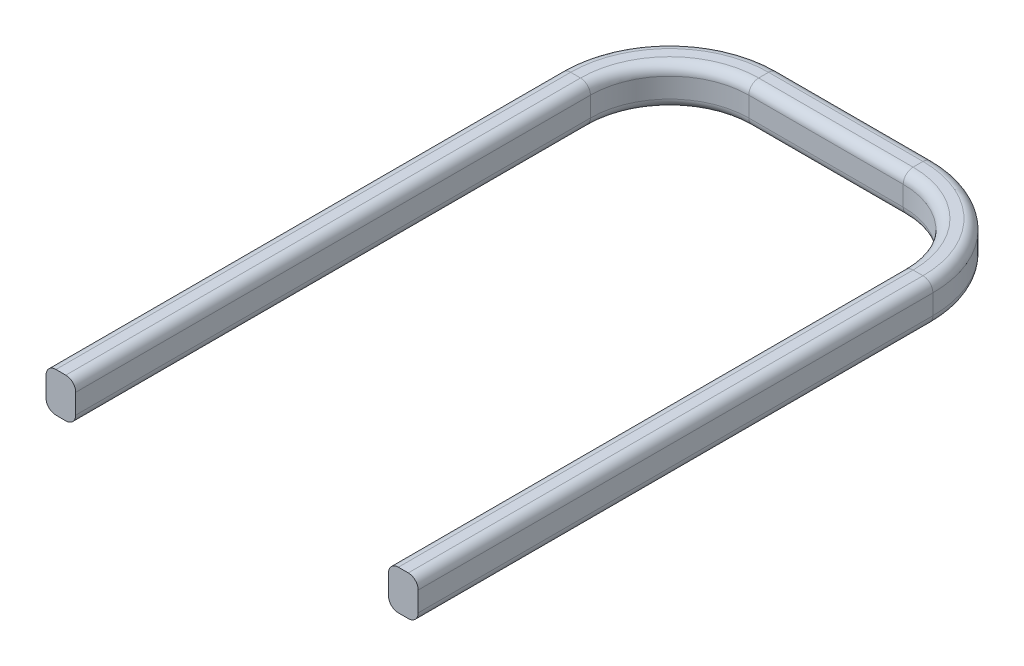
ISO-10303-21;
HEADER;
FILE_DESCRIPTION(('STEP AP214'),'2;1');
FILE_NAME('part.step','',(''),(''),'','','');
FILE_SCHEMA(('AUTOMOTIVE_DESIGN { 1 0 10303 214 1 1 1 1 }'));
ENDSEC;
DATA;
#1=APPLICATION_CONTEXT('core data for automotive mechanical design processes');
#2=APPLICATION_PROTOCOL_DEFINITION('international standard','automotive_design',2000,#1);
#3=PRODUCT_CONTEXT('',#1,'mechanical');
#4=PRODUCT('Part','Part','',(#3));
#5=PRODUCT_RELATED_PRODUCT_CATEGORY('part','',(#4));
#6=PRODUCT_DEFINITION_FORMATION('','',#4);
#7=PRODUCT_DEFINITION_CONTEXT('part definition',#1,'design');
#8=PRODUCT_DEFINITION('design','',#6,#7);
#9=PRODUCT_DEFINITION_SHAPE('','',#8);
#10=(LENGTH_UNIT() NAMED_UNIT(*) SI_UNIT(.MILLI.,.METRE.));
#11=(NAMED_UNIT(*) PLANE_ANGLE_UNIT() SI_UNIT($,.RADIAN.));
#12=(NAMED_UNIT(*) SI_UNIT($,.STERADIAN.) SOLID_ANGLE_UNIT());
#13=UNCERTAINTY_MEASURE_WITH_UNIT(LENGTH_MEASURE(1.E-05),#10,'distance_accuracy_value','');
#14=(GEOMETRIC_REPRESENTATION_CONTEXT(3) GLOBAL_UNCERTAINTY_ASSIGNED_CONTEXT((#13)) GLOBAL_UNIT_ASSIGNED_CONTEXT((#10,
#11,#12)) REPRESENTATION_CONTEXT('',''));
#15=CARTESIAN_POINT('',(0.,0.,0.));
#16=DIRECTION('',(0.,0.,1.));
#17=DIRECTION('',(1.,0.,0.));
#18=AXIS2_PLACEMENT_3D('',#15,#16,#17);
#19=CARTESIAN_POINT('',(0.,0.2775,-5.01095152284982));
#20=DIRECTION('',(0.,0.,1.));
#21=DIRECTION('',(1.,0.,0.));
#22=AXIS2_PLACEMENT_3D('',#19,#20,#21);
#23=PLANE('',#22);
#24=DIRECTION('',(0.,-1.,0.));
#25=VECTOR('',#24,1.);
#26=CARTESIAN_POINT('',(-2.0915,0.2775,-5.01095152284982));
#27=LINE('',#26,#25);
#28=CARTESIAN_POINT('',(-2.0915,0.61125,-5.01095152284982));
#29=VERTEX_POINT('',#28);
#30=CARTESIAN_POINT('',(-2.0915,0.38875,-5.01095152284982));
#31=VERTEX_POINT('',#30);
#32=EDGE_CURVE('E383',#29,#31,#27,.T.);
#33=ORIENTED_EDGE('',*,*,#32,.T.);
#34=CARTESIAN_POINT('',(-1.98025,0.38875,-5.01095152284982));
#35=DIRECTION('',(0.,0.,1.));
#36=DIRECTION('',(1.,0.,0.));
#37=AXIS2_PLACEMENT_3D('',#34,#35,#36);
#38=CIRCLE('',#37,0.11125);
#39=CARTESIAN_POINT('',(-1.98025,0.2775,-5.01095152284982));
#40=VERTEX_POINT('',#39);
#41=EDGE_CURVE('E317',#31,#40,#38,.T.);
#42=ORIENTED_EDGE('',*,*,#41,.T.);
#43=DIRECTION('',(1.,0.,0.));
#44=VECTOR('',#43,1.);
#45=CARTESIAN_POINT('',(-1.75775,0.2775,-5.01095152284982));
#46=LINE('',#45,#44);
#47=CARTESIAN_POINT('',(-1.869,0.2775,-5.01095152284982));
#48=VERTEX_POINT('',#47);
#49=EDGE_CURVE('E391',#40,#48,#46,.T.);
#50=ORIENTED_EDGE('',*,*,#49,.T.);
#51=CARTESIAN_POINT('',(-1.869,0.38875,-5.01095152284982));
#52=DIRECTION('',(0.,0.,1.));
#53=DIRECTION('',(1.,0.,0.));
#54=AXIS2_PLACEMENT_3D('',#51,#52,#53);
#55=CIRCLE('',#54,0.11125);
#56=CARTESIAN_POINT('',(-1.75775,0.38875,-5.01095152284982));
#57=VERTEX_POINT('',#56);
#58=EDGE_CURVE('E320',#48,#57,#55,.T.);
#59=ORIENTED_EDGE('',*,*,#58,.T.);
#60=DIRECTION('',(0.,1.,0.));
#61=VECTOR('',#60,1.);
#62=CARTESIAN_POINT('',(-1.75775,0.2775,-5.01095152284982));
#63=LINE('',#62,#61);
#64=CARTESIAN_POINT('',(-1.75775,0.61125,-5.01095152284982));
#65=VERTEX_POINT('',#64);
#66=EDGE_CURVE('E340',#57,#65,#63,.T.);
#67=ORIENTED_EDGE('',*,*,#66,.T.);
#68=CARTESIAN_POINT('',(-1.869,0.61125,-5.01095152284982));
#69=DIRECTION('',(0.,0.,1.));
#70=DIRECTION('',(1.,0.,0.));
#71=AXIS2_PLACEMENT_3D('',#68,#69,#70);
#72=CIRCLE('',#71,0.11125);
#73=CARTESIAN_POINT('',(-1.869,0.7225,-5.01095152284982));
#74=VERTEX_POINT('',#73);
#75=EDGE_CURVE('E68',#65,#74,#72,.T.);
#76=ORIENTED_EDGE('',*,*,#75,.T.);
#77=DIRECTION('',(-1.,0.,0.));
#78=VECTOR('',#77,1.);
#79=CARTESIAN_POINT('',(-1.75775,0.7225,-5.01095152284982));
#80=LINE('',#79,#78);
#81=CARTESIAN_POINT('',(-1.98025,0.7225,-5.01095152284982));
#82=VERTEX_POINT('',#81);
#83=EDGE_CURVE('E387',#74,#82,#80,.T.);
#84=ORIENTED_EDGE('',*,*,#83,.T.);
#85=CARTESIAN_POINT('',(-1.98025,0.61125,-5.01095152284982));
#86=DIRECTION('',(0.,0.,1.));
#87=DIRECTION('',(1.,0.,0.));
#88=AXIS2_PLACEMENT_3D('',#85,#86,#87);
#89=CIRCLE('',#88,0.11125);
#90=EDGE_CURVE('E314',#82,#29,#89,.T.);
#91=ORIENTED_EDGE('',*,*,#90,.T.);
#92=EDGE_LOOP('',(#33,#42,#50,#59,#67,#76,#84,#91));
#93=FACE_BOUND('',#92,.T.);
#94=ADVANCED_FACE('F43',(#93),#23,.T.);
#95=CARTESIAN_POINT('',(0.,0.2775,-5.01095152284982));
#96=DIRECTION('',(0.,0.,-1.));
#97=DIRECTION('',(-1.,0.,0.));
#98=AXIS2_PLACEMENT_3D('',#95,#96,#97);
#99=PLANE('',#98);
#100=DIRECTION('',(-1.,0.,0.));
#101=VECTOR('',#100,1.);
#102=CARTESIAN_POINT('',(1.75775,0.2775,-5.01095152284982));
#103=LINE('',#102,#101);
#104=CARTESIAN_POINT('',(1.98025,0.2775,-5.01095152284982));
#105=VERTEX_POINT('',#104);
#106=CARTESIAN_POINT('',(1.869,0.2775,-5.01095152284982));
#107=VERTEX_POINT('',#106);
#108=EDGE_CURVE('E224',#105,#107,#103,.T.);
#109=ORIENTED_EDGE('',*,*,#108,.F.);
#110=CARTESIAN_POINT('',(1.98025,0.38875,-5.01095152284982));
#111=DIRECTION('',(0.,0.,-1.));
#112=DIRECTION('',(-1.,0.,0.));
#113=AXIS2_PLACEMENT_3D('',#110,#111,#112);
#114=CIRCLE('',#113,0.11125);
#115=CARTESIAN_POINT('',(2.0915,0.38875,-5.01095152284982));
#116=VERTEX_POINT('',#115);
#117=EDGE_CURVE('E206',#105,#116,#114,.F.);
#118=ORIENTED_EDGE('',*,*,#117,.T.);
#119=DIRECTION('',(0.,-1.,0.));
#120=VECTOR('',#119,1.);
#121=CARTESIAN_POINT('',(2.0915,0.2775,-5.01095152284982));
#122=LINE('',#121,#120);
#123=CARTESIAN_POINT('',(2.0915,0.61125,-5.01095152284982));
#124=VERTEX_POINT('',#123);
#125=EDGE_CURVE('E231',#124,#116,#122,.T.);
#126=ORIENTED_EDGE('',*,*,#125,.F.);
#127=CARTESIAN_POINT('',(1.98025,0.61125,-5.01095152284982));
#128=DIRECTION('',(0.,0.,-1.));
#129=DIRECTION('',(-1.,0.,0.));
#130=AXIS2_PLACEMENT_3D('',#127,#128,#129);
#131=CIRCLE('',#130,0.11125);
#132=CARTESIAN_POINT('',(1.98025,0.7225,-5.01095152284982));
#133=VERTEX_POINT('',#132);
#134=EDGE_CURVE('E230',#124,#133,#131,.F.);
#135=ORIENTED_EDGE('',*,*,#134,.T.);
#136=DIRECTION('',(1.,0.,0.));
#137=VECTOR('',#136,1.);
#138=CARTESIAN_POINT('',(1.75775,0.7225,-5.01095152284982));
#139=LINE('',#138,#137);
#140=CARTESIAN_POINT('',(1.869,0.7225,-5.01095152284982));
#141=VERTEX_POINT('',#140);
#142=EDGE_CURVE('E237',#141,#133,#139,.T.);
#143=ORIENTED_EDGE('',*,*,#142,.F.);
#144=CARTESIAN_POINT('',(1.869,0.61125,-5.01095152284982));
#145=DIRECTION('',(0.,0.,-1.));
#146=DIRECTION('',(-1.,0.,0.));
#147=AXIS2_PLACEMENT_3D('',#144,#145,#146);
#148=CIRCLE('',#147,0.11125);
#149=CARTESIAN_POINT('',(1.75775,0.61125,-5.01095152284982));
#150=VERTEX_POINT('',#149);
#151=EDGE_CURVE('E241',#141,#150,#148,.F.);
#152=ORIENTED_EDGE('',*,*,#151,.T.);
#153=DIRECTION('',(0.,1.,0.));
#154=VECTOR('',#153,1.);
#155=CARTESIAN_POINT('',(1.75775,0.2775,-5.01095152284982));
#156=LINE('',#155,#154);
#157=CARTESIAN_POINT('',(1.75775,0.38875,-5.01095152284982));
#158=VERTEX_POINT('',#157);
#159=EDGE_CURVE('E437',#158,#150,#156,.T.);
#160=ORIENTED_EDGE('',*,*,#159,.F.);
#161=CARTESIAN_POINT('',(1.869,0.38875,-5.01095152284982));
#162=DIRECTION('',(0.,0.,-1.));
#163=DIRECTION('',(-1.,0.,0.));
#164=AXIS2_PLACEMENT_3D('',#161,#162,#163);
#165=CIRCLE('',#164,0.11125);
#166=EDGE_CURVE('E220',#158,#107,#165,.F.);
#167=ORIENTED_EDGE('',*,*,#166,.T.);
#168=EDGE_LOOP('',(#109,#118,#126,#135,#143,#152,#160,#167));
#169=FACE_BOUND('',#168,.T.);
#170=ADVANCED_FACE('F233',(#169),#99,.F.);
#171=CARTESIAN_POINT('',(-1.75775,0.2775,-5.01095152284982));
#172=DIRECTION('',(-1.,0.,0.));
#173=DIRECTION('',(0.,0.,1.));
#174=AXIS2_PLACEMENT_3D('',#171,#172,#173);
#175=PLANE('',#174);
#176=ORIENTED_EDGE('',*,*,#66,.F.);
#177=DIRECTION('',(0.,0.,-1.));
#178=VECTOR('',#177,1.);
#179=CARTESIAN_POINT('',(-1.75775,0.38875,-5.01095152284982));
#180=LINE('',#179,#178);
#181=CARTESIAN_POINT('',(-1.75775,0.38875,-10.7959515228498));
#182=VERTEX_POINT('',#181);
#183=EDGE_CURVE('E323',#57,#182,#180,.T.);
#184=ORIENTED_EDGE('',*,*,#183,.T.);
#185=DIRECTION('',(0.,1.,0.));
#186=VECTOR('',#185,1.);
#187=CARTESIAN_POINT('',(-1.75775,0.2775,-10.7959515228498));
#188=LINE('',#187,#186);
#189=CARTESIAN_POINT('',(-1.75775,0.61125,-10.7959515228498));
#190=VERTEX_POINT('',#189);
#191=EDGE_CURVE('E392',#182,#190,#188,.T.);
#192=ORIENTED_EDGE('',*,*,#191,.T.);
#193=DIRECTION('',(0.,0.,-1.));
#194=VECTOR('',#193,1.);
#195=CARTESIAN_POINT('',(-1.75775,0.61125,-5.01095152284982));
#196=LINE('',#195,#194);
#197=EDGE_CURVE('E321',#190,#65,#196,.F.);
#198=ORIENTED_EDGE('',*,*,#197,.T.);
#199=EDGE_LOOP('',(#176,#184,#192,#198));
#200=FACE_BOUND('',#199,.T.);
#201=ADVANCED_FACE('F501',(#200),#175,.F.);
#202=CARTESIAN_POINT('',(-1.75775,0.7225,-5.01095152284982));
#203=DIRECTION('',(0.,-1.,0.));
#204=DIRECTION('',(1.,0.,0.));
#205=AXIS2_PLACEMENT_3D('',#202,#203,#204);
#206=PLANE('',#205);
#207=ORIENTED_EDGE('',*,*,#83,.F.);
#208=DIRECTION('',(0.,0.,-1.));
#209=VECTOR('',#208,1.);
#210=CARTESIAN_POINT('',(-1.869,0.7225,-5.01095152284982));
#211=LINE('',#210,#209);
#212=CARTESIAN_POINT('',(-1.869,0.7225,-10.7959515228498));
#213=VERTEX_POINT('',#212);
#214=EDGE_CURVE('E11',#74,#213,#211,.T.);
#215=ORIENTED_EDGE('',*,*,#214,.T.);
#216=DIRECTION('',(-1.,0.,0.));
#217=VECTOR('',#216,1.);
#218=CARTESIAN_POINT('',(-1.75775,0.7225,-10.7959515228498));
#219=LINE('',#218,#217);
#220=CARTESIAN_POINT('',(-1.98025,0.7225,-10.7959515228498));
#221=VERTEX_POINT('',#220);
#222=EDGE_CURVE('E404',#213,#221,#219,.T.);
#223=ORIENTED_EDGE('',*,*,#222,.T.);
#224=DIRECTION('',(0.,0.,-1.));
#225=VECTOR('',#224,1.);
#226=CARTESIAN_POINT('',(-1.98025,0.7225,-5.01095152284982));
#227=LINE('',#226,#225);
#228=EDGE_CURVE('E55',#221,#82,#227,.F.);
#229=ORIENTED_EDGE('',*,*,#228,.T.);
#230=EDGE_LOOP('',(#207,#215,#223,#229));
#231=FACE_BOUND('',#230,.T.);
#232=ADVANCED_FACE('F506',(#231),#206,.F.);
#233=CARTESIAN_POINT('',(-2.0915,0.2775,-5.01095152284982));
#234=DIRECTION('',(1.,0.,0.));
#235=DIRECTION('',(0.,0.,-1.));
#236=AXIS2_PLACEMENT_3D('',#233,#234,#235);
#237=PLANE('',#236);
#238=DIRECTION('',(0.,-1.,0.));
#239=VECTOR('',#238,1.);
#240=CARTESIAN_POINT('',(-2.0915,0.2775,-10.7959515228498));
#241=LINE('',#240,#239);
#242=CARTESIAN_POINT('',(-2.0915,0.61125,-10.7959515228498));
#243=VERTEX_POINT('',#242);
#244=CARTESIAN_POINT('',(-2.0915,0.38875,-10.7959515228498));
#245=VERTEX_POINT('',#244);
#246=EDGE_CURVE('E402',#243,#245,#241,.T.);
#247=ORIENTED_EDGE('',*,*,#246,.T.);
#248=DIRECTION('',(0.,0.,-1.));
#249=VECTOR('',#248,1.);
#250=CARTESIAN_POINT('',(-2.0915,0.38875,-5.01095152284982));
#251=LINE('',#250,#249);
#252=EDGE_CURVE('E315',#245,#31,#251,.F.);
#253=ORIENTED_EDGE('',*,*,#252,.T.);
#254=ORIENTED_EDGE('',*,*,#32,.F.);
#255=DIRECTION('',(0.,0.,-1.));
#256=VECTOR('',#255,1.);
#257=CARTESIAN_POINT('',(-2.0915,0.61125,-5.01095152284982));
#258=LINE('',#257,#256);
#259=EDGE_CURVE('E309',#29,#243,#258,.T.);
#260=ORIENTED_EDGE('',*,*,#259,.T.);
#261=EDGE_LOOP('',(#247,#253,#254,#260));
#262=FACE_BOUND('',#261,.T.);
#263=ADVANCED_FACE('F386',(#262),#237,.F.);
#264=CARTESIAN_POINT('',(-1.75775,0.2775,-5.01095152284982));
#265=DIRECTION('',(0.,1.,0.));
#266=DIRECTION('',(-1.,0.,0.));
#267=AXIS2_PLACEMENT_3D('',#264,#265,#266);
#268=PLANE('',#267);
#269=ORIENTED_EDGE('',*,*,#49,.F.);
#270=DIRECTION('',(0.,0.,-1.));
#271=VECTOR('',#270,1.);
#272=CARTESIAN_POINT('',(-1.98025,0.2775,-5.01095152284982));
#273=LINE('',#272,#271);
#274=CARTESIAN_POINT('',(-1.98025,0.2775,-10.7959515228498));
#275=VERTEX_POINT('',#274);
#276=EDGE_CURVE('E306',#40,#275,#273,.T.);
#277=ORIENTED_EDGE('',*,*,#276,.T.);
#278=DIRECTION('',(1.,0.,0.));
#279=VECTOR('',#278,1.);
#280=CARTESIAN_POINT('',(-1.75775,0.2775,-10.7959515228498));
#281=LINE('',#280,#279);
#282=CARTESIAN_POINT('',(-1.869,0.2775,-10.7959515228498));
#283=VERTEX_POINT('',#282);
#284=EDGE_CURVE('E401',#275,#283,#281,.T.);
#285=ORIENTED_EDGE('',*,*,#284,.T.);
#286=DIRECTION('',(0.,0.,-1.));
#287=VECTOR('',#286,1.);
#288=CARTESIAN_POINT('',(-1.869,0.2775,-5.01095152284982));
#289=LINE('',#288,#287);
#290=EDGE_CURVE('E308',#283,#48,#289,.F.);
#291=ORIENTED_EDGE('',*,*,#290,.T.);
#292=EDGE_LOOP('',(#269,#277,#285,#291));
#293=FACE_BOUND('',#292,.T.);
#294=ADVANCED_FACE('F513',(#293),#268,.F.);
#295=CARTESIAN_POINT('',(-0.867750000000001,0.2775,-10.7959515228498));
#296=DIRECTION('',(0.,-1.,0.));
#297=DIRECTION('',(0.,0.,-1.));
#298=AXIS2_PLACEMENT_3D('',#295,#296,#297);
#299=CYLINDRICAL_SURFACE('',#298,0.89);
#300=ORIENTED_EDGE('',*,*,#191,.F.);
#301=CARTESIAN_POINT('',(-0.867750000000001,0.38875,-10.7959515228498));
#302=DIRECTION('',(0.,1.,0.));
#303=DIRECTION('',(0.,0.,1.));
#304=AXIS2_PLACEMENT_3D('',#301,#302,#303);
#305=CIRCLE('',#304,0.89);
#306=CARTESIAN_POINT('',(-0.867749999999995,0.38875,-11.6859515228498));
#307=VERTEX_POINT('',#306);
#308=EDGE_CURVE('E290',#182,#307,#305,.F.);
#309=ORIENTED_EDGE('',*,*,#308,.T.);
#310=DIRECTION('',(0.,1.,0.));
#311=VECTOR('',#310,1.);
#312=CARTESIAN_POINT('',(-0.867749999999995,0.2775,-11.6859515228498));
#313=LINE('',#312,#311);
#314=CARTESIAN_POINT('',(-0.867749999999995,0.61125,-11.6859515228498));
#315=VERTEX_POINT('',#314);
#316=EDGE_CURVE('E423',#307,#315,#313,.T.);
#317=ORIENTED_EDGE('',*,*,#316,.T.);
#318=CARTESIAN_POINT('',(-0.867750000000001,0.61125,-10.7959515228498));
#319=DIRECTION('',(0.,-1.,0.));
#320=DIRECTION('',(0.,0.,-1.));
#321=AXIS2_PLACEMENT_3D('',#318,#319,#320);
#322=CIRCLE('',#321,0.89);
#323=EDGE_CURVE('E282',#315,#190,#322,.F.);
#324=ORIENTED_EDGE('',*,*,#323,.T.);
#325=EDGE_LOOP('',(#300,#309,#317,#324));
#326=FACE_BOUND('',#325,.T.);
#327=ADVANCED_FACE('F500',(#326),#299,.F.);
#328=CARTESIAN_POINT('',(-1.75775,0.7225,-10.7959515228498));
#329=DIRECTION('',(0.,-1.,0.));
#330=DIRECTION('',(0.,0.,-1.));
#331=AXIS2_PLACEMENT_3D('',#328,#329,#330);
#332=PLANE('',#331);
#333=ORIENTED_EDGE('',*,*,#222,.F.);
#334=CARTESIAN_POINT('',(-0.867750000000001,0.7225,-10.7959515228498));
#335=DIRECTION('',(0.,-1.,0.));
#336=DIRECTION('',(0.,0.,-1.));
#337=AXIS2_PLACEMENT_3D('',#334,#335,#336);
#338=CIRCLE('',#337,1.00125);
#339=CARTESIAN_POINT('',(-0.867749999999994,0.7225,-11.7972015228498));
#340=VERTEX_POINT('',#339);
#341=EDGE_CURVE('E302',#213,#340,#338,.T.);
#342=ORIENTED_EDGE('',*,*,#341,.T.);
#343=DIRECTION('',(0.,0.,-1.));
#344=VECTOR('',#343,1.);
#345=CARTESIAN_POINT('',(-0.867749999999995,0.7225,-11.6859515228498));
#346=LINE('',#345,#344);
#347=CARTESIAN_POINT('',(-0.867749999999993,0.7225,-11.9084515228498));
#348=VERTEX_POINT('',#347);
#349=EDGE_CURVE('E408',#340,#348,#346,.T.);
#350=ORIENTED_EDGE('',*,*,#349,.T.);
#351=CARTESIAN_POINT('',(-0.867750000000001,0.7225,-10.7959515228498));
#352=DIRECTION('',(0.,-1.,0.));
#353=DIRECTION('',(0.,0.,-1.));
#354=AXIS2_PLACEMENT_3D('',#351,#352,#353);
#355=CIRCLE('',#354,1.1125);
#356=EDGE_CURVE('E305',#348,#221,#355,.F.);
#357=ORIENTED_EDGE('',*,*,#356,.T.);
#358=EDGE_LOOP('',(#333,#342,#350,#357));
#359=FACE_BOUND('',#358,.T.);
#360=ADVANCED_FACE('F488',(#359),#332,.F.);
#361=CARTESIAN_POINT('',(-0.867750000000001,0.2775,-10.7959515228498));
#362=DIRECTION('',(0.,-1.,0.));
#363=DIRECTION('',(0.,0.,-1.));
#364=AXIS2_PLACEMENT_3D('',#361,#362,#363);
#365=CYLINDRICAL_SURFACE('',#364,1.22375);
#366=DIRECTION('',(0.,-1.,0.));
#367=VECTOR('',#366,1.);
#368=CARTESIAN_POINT('',(-0.867749999999992,0.2775,-12.0197015228498));
#369=LINE('',#368,#367);
#370=CARTESIAN_POINT('',(-0.867749999999992,0.61125,-12.0197015228498));
#371=VERTEX_POINT('',#370);
#372=CARTESIAN_POINT('',(-0.867749999999992,0.38875,-12.0197015228498));
#373=VERTEX_POINT('',#372);
#374=EDGE_CURVE('E403',#371,#373,#369,.T.);
#375=ORIENTED_EDGE('',*,*,#374,.T.);
#376=CARTESIAN_POINT('',(-0.867750000000001,0.38875,-10.7959515228498));
#377=DIRECTION('',(0.,1.,0.));
#378=DIRECTION('',(0.,0.,1.));
#379=AXIS2_PLACEMENT_3D('',#376,#377,#378);
#380=CIRCLE('',#379,1.22375);
#381=EDGE_CURVE('E269',#373,#245,#380,.T.);
#382=ORIENTED_EDGE('',*,*,#381,.T.);
#383=ORIENTED_EDGE('',*,*,#246,.F.);
#384=CARTESIAN_POINT('',(-0.867750000000001,0.61125,-10.7959515228498));
#385=DIRECTION('',(0.,-1.,0.));
#386=DIRECTION('',(0.,0.,-1.));
#387=AXIS2_PLACEMENT_3D('',#384,#385,#386);
#388=CIRCLE('',#387,1.22375);
#389=EDGE_CURVE('E268',#243,#371,#388,.T.);
#390=ORIENTED_EDGE('',*,*,#389,.T.);
#391=EDGE_LOOP('',(#375,#382,#383,#390));
#392=FACE_BOUND('',#391,.T.);
#393=ADVANCED_FACE('F736',(#392),#365,.T.);
#394=CARTESIAN_POINT('',(-1.75775,0.2775,-10.7959515228498));
#395=DIRECTION('',(0.,1.,0.));
#396=DIRECTION('',(0.,0.,1.));
#397=AXIS2_PLACEMENT_3D('',#394,#395,#396);
#398=PLANE('',#397);
#399=ORIENTED_EDGE('',*,*,#284,.F.);
#400=CARTESIAN_POINT('',(-0.867750000000001,0.2775,-10.7959515228498));
#401=DIRECTION('',(0.,1.,0.));
#402=DIRECTION('',(0.,0.,1.));
#403=AXIS2_PLACEMENT_3D('',#400,#401,#402);
#404=CIRCLE('',#403,1.1125);
#405=CARTESIAN_POINT('',(-0.867749999999993,0.2775,-11.9084515228498));
#406=VERTEX_POINT('',#405);
#407=EDGE_CURVE('E266',#275,#406,#404,.F.);
#408=ORIENTED_EDGE('',*,*,#407,.T.);
#409=DIRECTION('',(0.,0.,1.));
#410=VECTOR('',#409,1.);
#411=CARTESIAN_POINT('',(-0.867749999999995,0.2775,-11.6859515228498));
#412=LINE('',#411,#410);
#413=CARTESIAN_POINT('',(-0.867749999999994,0.2775,-11.7972015228498));
#414=VERTEX_POINT('',#413);
#415=EDGE_CURVE('E410',#406,#414,#412,.T.);
#416=ORIENTED_EDGE('',*,*,#415,.T.);
#417=CARTESIAN_POINT('',(-0.867750000000001,0.2775,-10.7959515228498));
#418=DIRECTION('',(0.,1.,0.));
#419=DIRECTION('',(0.,0.,1.));
#420=AXIS2_PLACEMENT_3D('',#417,#418,#419);
#421=CIRCLE('',#420,1.00125);
#422=EDGE_CURVE('E262',#414,#283,#421,.T.);
#423=ORIENTED_EDGE('',*,*,#422,.T.);
#424=EDGE_LOOP('',(#399,#408,#416,#423));
#425=FACE_BOUND('',#424,.T.);
#426=ADVANCED_FACE('F729',(#425),#398,.F.);
#427=CARTESIAN_POINT('',(-0.867749999999994,0.2775,-11.6859515228498));
#428=DIRECTION('',(0.,0.,-1.));
#429=DIRECTION('',(-1.,0.,0.));
#430=AXIS2_PLACEMENT_3D('',#427,#428,#429);
#431=PLANE('',#430);
#432=ORIENTED_EDGE('',*,*,#316,.F.);
#433=DIRECTION('',(1.,0.,0.));
#434=VECTOR('',#433,1.);
#435=CARTESIAN_POINT('',(-0.867749999999994,0.38875,-11.6859515228498));
#436=LINE('',#435,#434);
#437=CARTESIAN_POINT('',(0.867749999999993,0.38875,-11.6859515228498));
#438=VERTEX_POINT('',#437);
#439=EDGE_CURVE('E285',#307,#438,#436,.T.);
#440=ORIENTED_EDGE('',*,*,#439,.T.);
#441=DIRECTION('',(0.,1.,0.));
#442=VECTOR('',#441,1.);
#443=CARTESIAN_POINT('',(0.867749999999993,0.2775,-11.6859515228498));
#444=LINE('',#443,#442);
#445=CARTESIAN_POINT('',(0.867749999999993,0.61125,-11.6859515228498));
#446=VERTEX_POINT('',#445);
#447=EDGE_CURVE('E421',#438,#446,#444,.T.);
#448=ORIENTED_EDGE('',*,*,#447,.T.);
#449=DIRECTION('',(1.,0.,0.));
#450=VECTOR('',#449,1.);
#451=CARTESIAN_POINT('',(-0.867749999999994,0.61125,-11.6859515228498));
#452=LINE('',#451,#450);
#453=EDGE_CURVE('E284',#446,#315,#452,.F.);
#454=ORIENTED_EDGE('',*,*,#453,.T.);
#455=EDGE_LOOP('',(#432,#440,#448,#454));
#456=FACE_BOUND('',#455,.T.);
#457=ADVANCED_FACE('F455',(#456),#431,.F.);
#458=CARTESIAN_POINT('',(-0.867749999999994,0.7225,-11.6859515228498));
#459=DIRECTION('',(0.,-1.,0.));
#460=DIRECTION('',(0.,0.,-1.));
#461=AXIS2_PLACEMENT_3D('',#458,#459,#460);
#462=PLANE('',#461);
#463=ORIENTED_EDGE('',*,*,#349,.F.);
#464=DIRECTION('',(1.,0.,0.));
#465=VECTOR('',#464,1.);
#466=CARTESIAN_POINT('',(-0.867749999999994,0.7225,-11.7972015228498));
#467=LINE('',#466,#465);
#468=CARTESIAN_POINT('',(0.867749999999993,0.7225,-11.7972015228498));
#469=VERTEX_POINT('',#468);
#470=EDGE_CURVE('E297',#340,#469,#467,.T.);
#471=ORIENTED_EDGE('',*,*,#470,.T.);
#472=DIRECTION('',(0.,0.,-1.));
#473=VECTOR('',#472,1.);
#474=CARTESIAN_POINT('',(0.867749999999993,0.7225,-11.6859515228498));
#475=LINE('',#474,#473);
#476=CARTESIAN_POINT('',(0.867749999999993,0.7225,-11.9084515228498));
#477=VERTEX_POINT('',#476);
#478=EDGE_CURVE('E412',#469,#477,#475,.T.);
#479=ORIENTED_EDGE('',*,*,#478,.T.);
#480=DIRECTION('',(1.,0.,0.));
#481=VECTOR('',#480,1.);
#482=CARTESIAN_POINT('',(-0.867749999999994,0.7225,-11.9084515228498));
#483=LINE('',#482,#481);
#484=EDGE_CURVE('E300',#477,#348,#483,.F.);
#485=ORIENTED_EDGE('',*,*,#484,.T.);
#486=EDGE_LOOP('',(#463,#471,#479,#485));
#487=FACE_BOUND('',#486,.T.);
#488=ADVANCED_FACE('F484',(#487),#462,.F.);
#489=CARTESIAN_POINT('',(-0.867749999999994,0.2775,-12.0197015228498));
#490=DIRECTION('',(0.,0.,1.));
#491=DIRECTION('',(1.,0.,0.));
#492=AXIS2_PLACEMENT_3D('',#489,#490,#491);
#493=PLANE('',#492);
#494=DIRECTION('',(0.,-1.,0.));
#495=VECTOR('',#494,1.);
#496=CARTESIAN_POINT('',(0.867749999999993,0.2775,-12.0197015228498));
#497=LINE('',#496,#495);
#498=CARTESIAN_POINT('',(0.867749999999993,0.61125,-12.0197015228498));
#499=VERTEX_POINT('',#498);
#500=CARTESIAN_POINT('',(0.867749999999993,0.38875,-12.0197015228498));
#501=VERTEX_POINT('',#500);
#502=EDGE_CURVE('E407',#499,#501,#497,.T.);
#503=ORIENTED_EDGE('',*,*,#502,.T.);
#504=DIRECTION('',(1.,0.,0.));
#505=VECTOR('',#504,1.);
#506=CARTESIAN_POINT('',(-0.867749999999994,0.38875,-12.0197015228498));
#507=LINE('',#506,#505);
#508=EDGE_CURVE('E265',#501,#373,#507,.F.);
#509=ORIENTED_EDGE('',*,*,#508,.T.);
#510=ORIENTED_EDGE('',*,*,#374,.F.);
#511=DIRECTION('',(1.,0.,0.));
#512=VECTOR('',#511,1.);
#513=CARTESIAN_POINT('',(-0.867749999999994,0.61125,-12.0197015228498));
#514=LINE('',#513,#512);
#515=EDGE_CURVE('E257',#371,#499,#514,.T.);
#516=ORIENTED_EDGE('',*,*,#515,.T.);
#517=EDGE_LOOP('',(#503,#509,#510,#516));
#518=FACE_BOUND('',#517,.T.);
#519=ADVANCED_FACE('F711',(#518),#493,.F.);
#520=CARTESIAN_POINT('',(-0.867749999999994,0.2775,-11.6859515228498));
#521=DIRECTION('',(0.,1.,0.));
#522=DIRECTION('',(0.,0.,1.));
#523=AXIS2_PLACEMENT_3D('',#520,#521,#522);
#524=PLANE('',#523);
#525=ORIENTED_EDGE('',*,*,#415,.F.);
#526=DIRECTION('',(1.,0.,0.));
#527=VECTOR('',#526,1.);
#528=CARTESIAN_POINT('',(-0.867749999999994,0.2775,-11.9084515228498));
#529=LINE('',#528,#527);
#530=CARTESIAN_POINT('',(0.867749999999993,0.2775,-11.9084515228498));
#531=VERTEX_POINT('',#530);
#532=EDGE_CURVE('E256',#406,#531,#529,.T.);
#533=ORIENTED_EDGE('',*,*,#532,.T.);
#534=DIRECTION('',(0.,0.,1.));
#535=VECTOR('',#534,1.);
#536=CARTESIAN_POINT('',(0.867749999999993,0.2775,-11.6859515228498));
#537=LINE('',#536,#535);
#538=CARTESIAN_POINT('',(0.867749999999993,0.2775,-11.7972015228498));
#539=VERTEX_POINT('',#538);
#540=EDGE_CURVE('E411',#531,#539,#537,.T.);
#541=ORIENTED_EDGE('',*,*,#540,.T.);
#542=DIRECTION('',(1.,0.,0.));
#543=VECTOR('',#542,1.);
#544=CARTESIAN_POINT('',(-0.867749999999994,0.2775,-11.7972015228498));
#545=LINE('',#544,#543);
#546=EDGE_CURVE('E258',#539,#414,#545,.F.);
#547=ORIENTED_EDGE('',*,*,#546,.T.);
#548=EDGE_LOOP('',(#525,#533,#541,#547));
#549=FACE_BOUND('',#548,.T.);
#550=ADVANCED_FACE('F702',(#549),#524,.F.);
#551=CARTESIAN_POINT('',(0.867749999999999,0.2775,-10.7959515228498));
#552=DIRECTION('',(0.,-1.,0.));
#553=DIRECTION('',(0.,0.,-1.));
#554=AXIS2_PLACEMENT_3D('',#551,#552,#553);
#555=CYLINDRICAL_SURFACE('',#554,0.89);
#556=ORIENTED_EDGE('',*,*,#447,.F.);
#557=CARTESIAN_POINT('',(0.867749999999999,0.38875,-10.7959515228498));
#558=DIRECTION('',(0.,1.,0.));
#559=DIRECTION('',(0.,0.,1.));
#560=AXIS2_PLACEMENT_3D('',#557,#558,#559);
#561=CIRCLE('',#560,0.89);
#562=CARTESIAN_POINT('',(1.75775,0.38875,-10.7959515228498));
#563=VERTEX_POINT('',#562);
#564=EDGE_CURVE('E276',#438,#563,#561,.F.);
#565=ORIENTED_EDGE('',*,*,#564,.T.);
#566=DIRECTION('',(0.,1.,0.));
#567=VECTOR('',#566,1.);
#568=CARTESIAN_POINT('',(1.75775,0.2775,-10.7959515228498));
#569=LINE('',#568,#567);
#570=CARTESIAN_POINT('',(1.75775,0.61125,-10.7959515228498));
#571=VERTEX_POINT('',#570);
#572=EDGE_CURVE('E422',#563,#571,#569,.T.);
#573=ORIENTED_EDGE('',*,*,#572,.T.);
#574=CARTESIAN_POINT('',(0.867749999999999,0.61125,-10.7959515228498));
#575=DIRECTION('',(0.,-1.,0.));
#576=DIRECTION('',(0.,0.,-1.));
#577=AXIS2_PLACEMENT_3D('',#574,#575,#576);
#578=CIRCLE('',#577,0.89);
#579=EDGE_CURVE('E280',#571,#446,#578,.F.);
#580=ORIENTED_EDGE('',*,*,#579,.T.);
#581=EDGE_LOOP('',(#556,#565,#573,#580));
#582=FACE_BOUND('',#581,.T.);
#583=ADVANCED_FACE('F700',(#582),#555,.F.);
#584=CARTESIAN_POINT('',(0.867749999999993,0.7225,-11.6859515228498));
#585=DIRECTION('',(0.,-1.,0.));
#586=DIRECTION('',(0.,0.,-1.));
#587=AXIS2_PLACEMENT_3D('',#584,#585,#586);
#588=PLANE('',#587);
#589=ORIENTED_EDGE('',*,*,#478,.F.);
#590=CARTESIAN_POINT('',(0.867749999999999,0.7225,-10.7959515228498));
#591=DIRECTION('',(0.,-1.,0.));
#592=DIRECTION('',(0.,0.,-1.));
#593=AXIS2_PLACEMENT_3D('',#590,#591,#592);
#594=CIRCLE('',#593,1.00125);
#595=CARTESIAN_POINT('',(1.869,0.7225,-10.7959515228498));
#596=VERTEX_POINT('',#595);
#597=EDGE_CURVE('E299',#469,#596,#594,.T.);
#598=ORIENTED_EDGE('',*,*,#597,.T.);
#599=DIRECTION('',(1.,0.,0.));
#600=VECTOR('',#599,1.);
#601=CARTESIAN_POINT('',(1.75775,0.7225,-10.7959515228498));
#602=LINE('',#601,#600);
#603=CARTESIAN_POINT('',(1.98025,0.7225,-10.7959515228498));
#604=VERTEX_POINT('',#603);
#605=EDGE_CURVE('E417',#596,#604,#602,.T.);
#606=ORIENTED_EDGE('',*,*,#605,.T.);
#607=CARTESIAN_POINT('',(0.867749999999999,0.7225,-10.7959515228498));
#608=DIRECTION('',(0.,-1.,0.));
#609=DIRECTION('',(0.,0.,-1.));
#610=AXIS2_PLACEMENT_3D('',#607,#608,#609);
#611=CIRCLE('',#610,1.1125);
#612=EDGE_CURVE('E294',#604,#477,#611,.F.);
#613=ORIENTED_EDGE('',*,*,#612,.T.);
#614=EDGE_LOOP('',(#589,#598,#606,#613));
#615=FACE_BOUND('',#614,.T.);
#616=ADVANCED_FACE('F466',(#615),#588,.F.);
#617=CARTESIAN_POINT('',(0.867749999999999,0.2775,-10.7959515228498));
#618=DIRECTION('',(0.,-1.,0.));
#619=DIRECTION('',(0.,0.,-1.));
#620=AXIS2_PLACEMENT_3D('',#617,#618,#619);
#621=CYLINDRICAL_SURFACE('',#620,1.22375);
#622=DIRECTION('',(0.,-1.,0.));
#623=VECTOR('',#622,1.);
#624=CARTESIAN_POINT('',(2.0915,0.2775,-10.7959515228498));
#625=LINE('',#624,#623);
#626=CARTESIAN_POINT('',(2.0915,0.61125,-10.7959515228498));
#627=VERTEX_POINT('',#626);
#628=CARTESIAN_POINT('',(2.0915,0.38875,-10.7959515228498));
#629=VERTEX_POINT('',#628);
#630=EDGE_CURVE('E414',#627,#629,#625,.T.);
#631=ORIENTED_EDGE('',*,*,#630,.T.);
#632=CARTESIAN_POINT('',(0.867749999999999,0.38875,-10.7959515228498));
#633=DIRECTION('',(0.,1.,0.));
#634=DIRECTION('',(0.,0.,1.));
#635=AXIS2_PLACEMENT_3D('',#632,#633,#634);
#636=CIRCLE('',#635,1.22375);
#637=EDGE_CURVE('E255',#629,#501,#636,.T.);
#638=ORIENTED_EDGE('',*,*,#637,.T.);
#639=ORIENTED_EDGE('',*,*,#502,.F.);
#640=CARTESIAN_POINT('',(0.867749999999999,0.61125,-10.7959515228498));
#641=DIRECTION('',(0.,-1.,0.));
#642=DIRECTION('',(0.,0.,-1.));
#643=AXIS2_PLACEMENT_3D('',#640,#641,#642);
#644=CIRCLE('',#643,1.22375);
#645=EDGE_CURVE('E252',#499,#627,#644,.T.);
#646=ORIENTED_EDGE('',*,*,#645,.T.);
#647=EDGE_LOOP('',(#631,#638,#639,#646));
#648=FACE_BOUND('',#647,.T.);
#649=ADVANCED_FACE('F685',(#648),#621,.T.);
#650=CARTESIAN_POINT('',(0.867749999999993,0.2775,-11.6859515228498));
#651=DIRECTION('',(0.,1.,0.));
#652=DIRECTION('',(0.,0.,1.));
#653=AXIS2_PLACEMENT_3D('',#650,#651,#652);
#654=PLANE('',#653);
#655=ORIENTED_EDGE('',*,*,#540,.F.);
#656=CARTESIAN_POINT('',(0.867749999999999,0.2775,-10.7959515228498));
#657=DIRECTION('',(0.,1.,0.));
#658=DIRECTION('',(0.,0.,1.));
#659=AXIS2_PLACEMENT_3D('',#656,#657,#658);
#660=CIRCLE('',#659,1.1125);
#661=CARTESIAN_POINT('',(1.98025,0.2775,-10.7959515228498));
#662=VERTEX_POINT('',#661);
#663=EDGE_CURVE('E249',#531,#662,#660,.F.);
#664=ORIENTED_EDGE('',*,*,#663,.T.);
#665=DIRECTION('',(-1.,0.,0.));
#666=VECTOR('',#665,1.);
#667=CARTESIAN_POINT('',(1.75775,0.2775,-10.7959515228498));
#668=LINE('',#667,#666);
#669=CARTESIAN_POINT('',(1.869,0.2775,-10.7959515228498));
#670=VERTEX_POINT('',#669);
#671=EDGE_CURVE('E229',#662,#670,#668,.T.);
#672=ORIENTED_EDGE('',*,*,#671,.T.);
#673=CARTESIAN_POINT('',(0.867749999999999,0.2775,-10.7959515228498));
#674=DIRECTION('',(0.,1.,0.));
#675=DIRECTION('',(0.,0.,1.));
#676=AXIS2_PLACEMENT_3D('',#673,#674,#675);
#677=CIRCLE('',#676,1.00125);
#678=EDGE_CURVE('E246',#670,#539,#677,.T.);
#679=ORIENTED_EDGE('',*,*,#678,.T.);
#680=EDGE_LOOP('',(#655,#664,#672,#679));
#681=FACE_BOUND('',#680,.T.);
#682=ADVANCED_FACE('F532',(#681),#654,.F.);
#683=CARTESIAN_POINT('',(1.75775,0.2775,-10.7959515228498));
#684=DIRECTION('',(1.,0.,0.));
#685=DIRECTION('',(0.,0.,-1.));
#686=AXIS2_PLACEMENT_3D('',#683,#684,#685);
#687=PLANE('',#686);
#688=ORIENTED_EDGE('',*,*,#572,.F.);
#689=DIRECTION('',(0.,0.,1.));
#690=VECTOR('',#689,1.);
#691=CARTESIAN_POINT('',(1.75775,0.38875,-10.7959515228498));
#692=LINE('',#691,#690);
#693=EDGE_CURVE('E273',#563,#158,#692,.T.);
#694=ORIENTED_EDGE('',*,*,#693,.T.);
#695=ORIENTED_EDGE('',*,*,#159,.T.);
#696=DIRECTION('',(0.,0.,1.));
#697=VECTOR('',#696,1.);
#698=CARTESIAN_POINT('',(1.75775,0.61125,-10.7959515228498));
#699=LINE('',#698,#697);
#700=EDGE_CURVE('E275',#150,#571,#699,.F.);
#701=ORIENTED_EDGE('',*,*,#700,.T.);
#702=EDGE_LOOP('',(#688,#694,#695,#701));
#703=FACE_BOUND('',#702,.T.);
#704=ADVANCED_FACE('F667',(#703),#687,.F.);
#705=CARTESIAN_POINT('',(1.75775,0.7225,-10.7959515228498));
#706=DIRECTION('',(0.,-1.,0.));
#707=DIRECTION('',(1.,0.,0.));
#708=AXIS2_PLACEMENT_3D('',#705,#706,#707);
#709=PLANE('',#708);
#710=ORIENTED_EDGE('',*,*,#605,.F.);
#711=DIRECTION('',(0.,0.,1.));
#712=VECTOR('',#711,1.);
#713=CARTESIAN_POINT('',(1.869,0.7225,-10.7959515228498));
#714=LINE('',#713,#712);
#715=EDGE_CURVE('E292',#596,#141,#714,.T.);
#716=ORIENTED_EDGE('',*,*,#715,.T.);
#717=ORIENTED_EDGE('',*,*,#142,.T.);
#718=DIRECTION('',(0.,0.,1.));
#719=VECTOR('',#718,1.);
#720=CARTESIAN_POINT('',(1.98025,0.7225,-10.7959515228498));
#721=LINE('',#720,#719);
#722=EDGE_CURVE('E287',#133,#604,#721,.F.);
#723=ORIENTED_EDGE('',*,*,#722,.T.);
#724=EDGE_LOOP('',(#710,#716,#717,#723));
#725=FACE_BOUND('',#724,.T.);
#726=ADVANCED_FACE('F473',(#725),#709,.F.);
#727=CARTESIAN_POINT('',(2.0915,0.2775,-10.7959515228498));
#728=DIRECTION('',(-1.,0.,0.));
#729=DIRECTION('',(0.,0.,1.));
#730=AXIS2_PLACEMENT_3D('',#727,#728,#729);
#731=PLANE('',#730);
#732=ORIENTED_EDGE('',*,*,#125,.T.);
#733=DIRECTION('',(0.,0.,1.));
#734=VECTOR('',#733,1.);
#735=CARTESIAN_POINT('',(2.0915,0.38875,-10.7959515228498));
#736=LINE('',#735,#734);
#737=EDGE_CURVE('E211',#116,#629,#736,.F.);
#738=ORIENTED_EDGE('',*,*,#737,.T.);
#739=ORIENTED_EDGE('',*,*,#630,.F.);
#740=DIRECTION('',(0.,0.,1.));
#741=VECTOR('',#740,1.);
#742=CARTESIAN_POINT('',(2.0915,0.61125,-10.7959515228498));
#743=LINE('',#742,#741);
#744=EDGE_CURVE('E216',#627,#124,#743,.T.);
#745=ORIENTED_EDGE('',*,*,#744,.T.);
#746=EDGE_LOOP('',(#732,#738,#739,#745));
#747=FACE_BOUND('',#746,.T.);
#748=ADVANCED_FACE('F525',(#747),#731,.F.);
#749=CARTESIAN_POINT('',(1.75775,0.2775,-10.7959515228498));
#750=DIRECTION('',(0.,1.,0.));
#751=DIRECTION('',(-1.,0.,0.));
#752=AXIS2_PLACEMENT_3D('',#749,#750,#751);
#753=PLANE('',#752);
#754=ORIENTED_EDGE('',*,*,#671,.F.);
#755=DIRECTION('',(0.,0.,1.));
#756=VECTOR('',#755,1.);
#757=CARTESIAN_POINT('',(1.98025,0.2775,-10.7959515228498));
#758=LINE('',#757,#756);
#759=EDGE_CURVE('E209',#662,#105,#758,.T.);
#760=ORIENTED_EDGE('',*,*,#759,.T.);
#761=ORIENTED_EDGE('',*,*,#108,.T.);
#762=DIRECTION('',(0.,0.,1.));
#763=VECTOR('',#762,1.);
#764=CARTESIAN_POINT('',(1.869,0.2775,-10.7959515228498));
#765=LINE('',#764,#763);
#766=EDGE_CURVE('E228',#107,#670,#765,.F.);
#767=ORIENTED_EDGE('',*,*,#766,.T.);
#768=EDGE_LOOP('',(#754,#760,#761,#767));
#769=FACE_BOUND('',#768,.T.);
#770=ADVANCED_FACE('F225',(#769),#753,.F.);
#771=CARTESIAN_POINT('',(-1.98025,0.38875,-5.01095152284982));
#772=DIRECTION('',(0.,0.,-1.));
#773=DIRECTION('',(-1.,0.,0.));
#774=AXIS2_PLACEMENT_3D('',#771,#772,#773);
#775=CYLINDRICAL_SURFACE('',#774,0.11125);
#776=ORIENTED_EDGE('',*,*,#41,.F.);
#777=ORIENTED_EDGE('',*,*,#252,.F.);
#778=CARTESIAN_POINT('',(-1.98025,0.38875,-10.7959515228498));
#779=DIRECTION('',(0.,0.,-1.));
#780=DIRECTION('',(-1.,0.,0.));
#781=AXIS2_PLACEMENT_3D('',#778,#779,#780);
#782=CIRCLE('',#781,0.11125);
#783=EDGE_CURVE('E333',#275,#245,#782,.T.);
#784=ORIENTED_EDGE('',*,*,#783,.F.);
#785=ORIENTED_EDGE('',*,*,#276,.F.);
#786=EDGE_LOOP('',(#776,#777,#784,#785));
#787=FACE_BOUND('',#786,.T.);
#788=ADVANCED_FACE('F523',(#787),#775,.T.);
#789=CARTESIAN_POINT('',(-0.867750000000001,0.38875,-10.7959515228498));
#790=DIRECTION('',(0.,1.,0.));
#791=DIRECTION('',(0.,0.,1.));
#792=AXIS2_PLACEMENT_3D('',#789,#790,#791);
#793=TOROIDAL_SURFACE('',#792,1.1125,0.11125);
#794=ORIENTED_EDGE('',*,*,#783,.T.);
#795=ORIENTED_EDGE('',*,*,#381,.F.);
#796=CARTESIAN_POINT('',(-0.867749999999993,0.38875,-11.9084515228498));
#797=DIRECTION('',(1.,0.,0.));
#798=DIRECTION('',(0.,0.,-1.));
#799=AXIS2_PLACEMENT_3D('',#796,#797,#798);
#800=CIRCLE('',#799,0.11125);
#801=EDGE_CURVE('E335',#406,#373,#800,.T.);
#802=ORIENTED_EDGE('',*,*,#801,.F.);
#803=ORIENTED_EDGE('',*,*,#407,.F.);
#804=EDGE_LOOP('',(#794,#795,#802,#803));
#805=FACE_BOUND('',#804,.T.);
#806=ADVANCED_FACE('F526',(#805),#793,.T.);
#807=CARTESIAN_POINT('',(-0.867749999999994,0.38875,-11.9084515228498));
#808=DIRECTION('',(1.,0.,0.));
#809=DIRECTION('',(0.,0.,-1.));
#810=AXIS2_PLACEMENT_3D('',#807,#808,#809);
#811=CYLINDRICAL_SURFACE('',#810,0.11125);
#812=ORIENTED_EDGE('',*,*,#801,.T.);
#813=ORIENTED_EDGE('',*,*,#508,.F.);
#814=CARTESIAN_POINT('',(0.867749999999993,0.38875,-11.9084515228498));
#815=DIRECTION('',(1.,0.,0.));
#816=DIRECTION('',(0.,0.,-1.));
#817=AXIS2_PLACEMENT_3D('',#814,#815,#816);
#818=CIRCLE('',#817,0.11125);
#819=EDGE_CURVE('E327',#531,#501,#818,.T.);
#820=ORIENTED_EDGE('',*,*,#819,.F.);
#821=ORIENTED_EDGE('',*,*,#532,.F.);
#822=EDGE_LOOP('',(#812,#813,#820,#821));
#823=FACE_BOUND('',#822,.T.);
#824=ADVANCED_FACE('F550',(#823),#811,.T.);
#825=CARTESIAN_POINT('',(0.867749999999999,0.38875,-10.7959515228498));
#826=DIRECTION('',(0.,1.,0.));
#827=DIRECTION('',(0.,0.,1.));
#828=AXIS2_PLACEMENT_3D('',#825,#826,#827);
#829=TOROIDAL_SURFACE('',#828,1.1125,0.11125);
#830=ORIENTED_EDGE('',*,*,#819,.T.);
#831=ORIENTED_EDGE('',*,*,#637,.F.);
#832=CARTESIAN_POINT('',(1.98025,0.38875,-10.7959515228498));
#833=DIRECTION('',(0.,0.,1.));
#834=DIRECTION('',(1.,0.,0.));
#835=AXIS2_PLACEMENT_3D('',#832,#833,#834);
#836=CIRCLE('',#835,0.11125);
#837=EDGE_CURVE('E326',#662,#629,#836,.T.);
#838=ORIENTED_EDGE('',*,*,#837,.F.);
#839=ORIENTED_EDGE('',*,*,#663,.F.);
#840=EDGE_LOOP('',(#830,#831,#838,#839));
#841=FACE_BOUND('',#840,.T.);
#842=ADVANCED_FACE('F542',(#841),#829,.T.);
#843=CARTESIAN_POINT('',(1.98025,0.38875,-10.7959515228498));
#844=DIRECTION('',(0.,0.,1.));
#845=DIRECTION('',(1.,0.,0.));
#846=AXIS2_PLACEMENT_3D('',#843,#844,#845);
#847=CYLINDRICAL_SURFACE('',#846,0.11125);
#848=ORIENTED_EDGE('',*,*,#837,.T.);
#849=ORIENTED_EDGE('',*,*,#737,.F.);
#850=ORIENTED_EDGE('',*,*,#117,.F.);
#851=ORIENTED_EDGE('',*,*,#759,.F.);
#852=EDGE_LOOP('',(#848,#849,#850,#851));
#853=FACE_BOUND('',#852,.T.);
#854=ADVANCED_FACE('F207',(#853),#847,.T.);
#855=CARTESIAN_POINT('',(-1.869,0.38875,-5.01095152284982));
#856=DIRECTION('',(0.,0.,-1.));
#857=DIRECTION('',(-1.,0.,0.));
#858=AXIS2_PLACEMENT_3D('',#855,#856,#857);
#859=CYLINDRICAL_SURFACE('',#858,0.11125);
#860=ORIENTED_EDGE('',*,*,#58,.F.);
#861=ORIENTED_EDGE('',*,*,#290,.F.);
#862=CARTESIAN_POINT('',(-1.869,0.38875,-10.7959515228498));
#863=DIRECTION('',(0.,0.,-1.));
#864=DIRECTION('',(-1.,0.,0.));
#865=AXIS2_PLACEMENT_3D('',#862,#863,#864);
#866=CIRCLE('',#865,0.11125);
#867=EDGE_CURVE('E328',#182,#283,#866,.T.);
#868=ORIENTED_EDGE('',*,*,#867,.F.);
#869=ORIENTED_EDGE('',*,*,#183,.F.);
#870=EDGE_LOOP('',(#860,#861,#868,#869));
#871=FACE_BOUND('',#870,.T.);
#872=ADVANCED_FACE('F543',(#871),#859,.T.);
#873=CARTESIAN_POINT('',(-0.867750000000001,0.38875,-10.7959515228498));
#874=DIRECTION('',(0.,1.,0.));
#875=DIRECTION('',(0.,0.,1.));
#876=AXIS2_PLACEMENT_3D('',#873,#874,#875);
#877=TOROIDAL_SURFACE('',#876,1.00125,0.11125);
#878=ORIENTED_EDGE('',*,*,#867,.T.);
#879=ORIENTED_EDGE('',*,*,#422,.F.);
#880=CARTESIAN_POINT('',(-0.867749999999994,0.38875,-11.7972015228498));
#881=DIRECTION('',(1.,0.,0.));
#882=DIRECTION('',(0.,0.,-1.));
#883=AXIS2_PLACEMENT_3D('',#880,#881,#882);
#884=CIRCLE('',#883,0.11125);
#885=EDGE_CURVE('E347',#307,#414,#884,.T.);
#886=ORIENTED_EDGE('',*,*,#885,.F.);
#887=ORIENTED_EDGE('',*,*,#308,.F.);
#888=EDGE_LOOP('',(#878,#879,#886,#887));
#889=FACE_BOUND('',#888,.T.);
#890=ADVANCED_FACE('F567',(#889),#877,.T.);
#891=CARTESIAN_POINT('',(-0.867749999999994,0.38875,-11.7972015228498));
#892=DIRECTION('',(1.,0.,0.));
#893=DIRECTION('',(0.,0.,-1.));
#894=AXIS2_PLACEMENT_3D('',#891,#892,#893);
#895=CYLINDRICAL_SURFACE('',#894,0.11125);
#896=ORIENTED_EDGE('',*,*,#885,.T.);
#897=ORIENTED_EDGE('',*,*,#546,.F.);
#898=CARTESIAN_POINT('',(0.867749999999993,0.38875,-11.7972015228498));
#899=DIRECTION('',(1.,0.,0.));
#900=DIRECTION('',(0.,0.,-1.));
#901=AXIS2_PLACEMENT_3D('',#898,#899,#900);
#902=CIRCLE('',#901,0.11125);
#903=EDGE_CURVE('E345',#438,#539,#902,.T.);
#904=ORIENTED_EDGE('',*,*,#903,.F.);
#905=ORIENTED_EDGE('',*,*,#439,.F.);
#906=EDGE_LOOP('',(#896,#897,#904,#905));
#907=FACE_BOUND('',#906,.T.);
#908=ADVANCED_FACE('F565',(#907),#895,.T.);
#909=CARTESIAN_POINT('',(0.867749999999999,0.38875,-10.7959515228498));
#910=DIRECTION('',(0.,1.,0.));
#911=DIRECTION('',(0.,0.,1.));
#912=AXIS2_PLACEMENT_3D('',#909,#910,#911);
#913=TOROIDAL_SURFACE('',#912,1.00125,0.11125);
#914=ORIENTED_EDGE('',*,*,#903,.T.);
#915=ORIENTED_EDGE('',*,*,#678,.F.);
#916=CARTESIAN_POINT('',(1.869,0.38875,-10.7959515228498));
#917=DIRECTION('',(0.,0.,1.));
#918=DIRECTION('',(1.,0.,0.));
#919=AXIS2_PLACEMENT_3D('',#916,#917,#918);
#920=CIRCLE('',#919,0.11125);
#921=EDGE_CURVE('E338',#563,#670,#920,.T.);
#922=ORIENTED_EDGE('',*,*,#921,.F.);
#923=ORIENTED_EDGE('',*,*,#564,.F.);
#924=EDGE_LOOP('',(#914,#915,#922,#923));
#925=FACE_BOUND('',#924,.T.);
#926=ADVANCED_FACE('F560',(#925),#913,.T.);
#927=CARTESIAN_POINT('',(1.869,0.38875,-10.7959515228498));
#928=DIRECTION('',(0.,0.,1.));
#929=DIRECTION('',(1.,0.,0.));
#930=AXIS2_PLACEMENT_3D('',#927,#928,#929);
#931=CYLINDRICAL_SURFACE('',#930,0.11125);
#932=ORIENTED_EDGE('',*,*,#921,.T.);
#933=ORIENTED_EDGE('',*,*,#766,.F.);
#934=ORIENTED_EDGE('',*,*,#166,.F.);
#935=ORIENTED_EDGE('',*,*,#693,.F.);
#936=EDGE_LOOP('',(#932,#933,#934,#935));
#937=FACE_BOUND('',#936,.T.);
#938=ADVANCED_FACE('F553',(#937),#931,.T.);
#939=CARTESIAN_POINT('',(-1.869,0.61125,-5.01095152284982));
#940=DIRECTION('',(0.,0.,-1.));
#941=DIRECTION('',(-1.,0.,0.));
#942=AXIS2_PLACEMENT_3D('',#939,#940,#941);
#943=CYLINDRICAL_SURFACE('',#942,0.11125);
#944=ORIENTED_EDGE('',*,*,#75,.F.);
#945=ORIENTED_EDGE('',*,*,#197,.F.);
#946=CARTESIAN_POINT('',(-1.869,0.61125,-10.7959515228498));
#947=DIRECTION('',(0.,0.,-1.));
#948=DIRECTION('',(-1.,0.,0.));
#949=AXIS2_PLACEMENT_3D('',#946,#947,#948);
#950=CIRCLE('',#949,0.11125);
#951=EDGE_CURVE('E341',#213,#190,#950,.T.);
#952=ORIENTED_EDGE('',*,*,#951,.F.);
#953=ORIENTED_EDGE('',*,*,#214,.F.);
#954=EDGE_LOOP('',(#944,#945,#952,#953));
#955=FACE_BOUND('',#954,.T.);
#956=ADVANCED_FACE('F508',(#955),#943,.T.);
#957=CARTESIAN_POINT('',(-0.867750000000001,0.61125,-10.7959515228498));
#958=DIRECTION('',(0.,-1.,0.));
#959=DIRECTION('',(0.,0.,-1.));
#960=AXIS2_PLACEMENT_3D('',#957,#958,#959);
#961=TOROIDAL_SURFACE('',#960,1.00125,0.11125);
#962=ORIENTED_EDGE('',*,*,#951,.T.);
#963=ORIENTED_EDGE('',*,*,#323,.F.);
#964=CARTESIAN_POINT('',(-0.867749999999994,0.61125,-11.7972015228498));
#965=DIRECTION('',(1.,0.,0.));
#966=DIRECTION('',(0.,0.,-1.));
#967=AXIS2_PLACEMENT_3D('',#964,#965,#966);
#968=CIRCLE('',#967,0.11125);
#969=EDGE_CURVE('E360',#340,#315,#968,.T.);
#970=ORIENTED_EDGE('',*,*,#969,.F.);
#971=ORIENTED_EDGE('',*,*,#341,.F.);
#972=EDGE_LOOP('',(#962,#963,#970,#971));
#973=FACE_BOUND('',#972,.T.);
#974=ADVANCED_FACE('F495',(#973),#961,.T.);
#975=CARTESIAN_POINT('',(-0.867749999999994,0.61125,-11.7972015228498));
#976=DIRECTION('',(1.,0.,0.));
#977=DIRECTION('',(0.,0.,-1.));
#978=AXIS2_PLACEMENT_3D('',#975,#976,#977);
#979=CYLINDRICAL_SURFACE('',#978,0.11125);
#980=ORIENTED_EDGE('',*,*,#969,.T.);
#981=ORIENTED_EDGE('',*,*,#453,.F.);
#982=CARTESIAN_POINT('',(0.867749999999993,0.61125,-11.7972015228498));
#983=DIRECTION('',(1.,0.,0.));
#984=DIRECTION('',(0.,0.,-1.));
#985=AXIS2_PLACEMENT_3D('',#982,#983,#984);
#986=CIRCLE('',#985,0.11125);
#987=EDGE_CURVE('E353',#469,#446,#986,.T.);
#988=ORIENTED_EDGE('',*,*,#987,.F.);
#989=ORIENTED_EDGE('',*,*,#470,.F.);
#990=EDGE_LOOP('',(#980,#981,#988,#989));
#991=FACE_BOUND('',#990,.T.);
#992=ADVANCED_FACE('F456',(#991),#979,.T.);
#993=CARTESIAN_POINT('',(0.867749999999999,0.61125,-10.7959515228498));
#994=DIRECTION('',(0.,-1.,0.));
#995=DIRECTION('',(0.,0.,-1.));
#996=AXIS2_PLACEMENT_3D('',#993,#994,#995);
#997=TOROIDAL_SURFACE('',#996,1.00125,0.11125);
#998=ORIENTED_EDGE('',*,*,#987,.T.);
#999=ORIENTED_EDGE('',*,*,#579,.F.);
#1000=CARTESIAN_POINT('',(1.869,0.61125,-10.7959515228498));
#1001=DIRECTION('',(0.,0.,1.));
#1002=DIRECTION('',(1.,0.,0.));
#1003=AXIS2_PLACEMENT_3D('',#1000,#1001,#1002);
#1004=CIRCLE('',#1003,0.11125);
#1005=EDGE_CURVE('E354',#596,#571,#1004,.T.);
#1006=ORIENTED_EDGE('',*,*,#1005,.F.);
#1007=ORIENTED_EDGE('',*,*,#597,.F.);
#1008=EDGE_LOOP('',(#998,#999,#1006,#1007));
#1009=FACE_BOUND('',#1008,.T.);
#1010=ADVANCED_FACE('F465',(#1009),#997,.T.);
#1011=CARTESIAN_POINT('',(1.869,0.61125,-10.7959515228498));
#1012=DIRECTION('',(0.,0.,1.));
#1013=DIRECTION('',(1.,0.,0.));
#1014=AXIS2_PLACEMENT_3D('',#1011,#1012,#1013);
#1015=CYLINDRICAL_SURFACE('',#1014,0.11125);
#1016=ORIENTED_EDGE('',*,*,#1005,.T.);
#1017=ORIENTED_EDGE('',*,*,#700,.F.);
#1018=ORIENTED_EDGE('',*,*,#151,.F.);
#1019=ORIENTED_EDGE('',*,*,#715,.F.);
#1020=EDGE_LOOP('',(#1016,#1017,#1018,#1019));
#1021=FACE_BOUND('',#1020,.T.);
#1022=ADVANCED_FACE('F573',(#1021),#1015,.T.);
#1023=CARTESIAN_POINT('',(-1.98025,0.61125,-5.01095152284982));
#1024=DIRECTION('',(0.,0.,-1.));
#1025=DIRECTION('',(-1.,0.,0.));
#1026=AXIS2_PLACEMENT_3D('',#1023,#1024,#1025);
#1027=CYLINDRICAL_SURFACE('',#1026,0.11125);
#1028=ORIENTED_EDGE('',*,*,#90,.F.);
#1029=ORIENTED_EDGE('',*,*,#228,.F.);
#1030=CARTESIAN_POINT('',(-1.98025,0.61125,-10.7959515228498));
#1031=DIRECTION('',(0.,0.,-1.));
#1032=DIRECTION('',(-1.,0.,0.));
#1033=AXIS2_PLACEMENT_3D('',#1030,#1031,#1032);
#1034=CIRCLE('',#1033,0.11125);
#1035=EDGE_CURVE('E50',#243,#221,#1034,.T.);
#1036=ORIENTED_EDGE('',*,*,#1035,.F.);
#1037=ORIENTED_EDGE('',*,*,#259,.F.);
#1038=EDGE_LOOP('',(#1028,#1029,#1036,#1037));
#1039=FACE_BOUND('',#1038,.T.);
#1040=ADVANCED_FACE('F44',(#1039),#1027,.T.);
#1041=CARTESIAN_POINT('',(-0.867750000000001,0.61125,-10.7959515228498));
#1042=DIRECTION('',(0.,-1.,0.));
#1043=DIRECTION('',(0.,0.,-1.));
#1044=AXIS2_PLACEMENT_3D('',#1041,#1042,#1043);
#1045=TOROIDAL_SURFACE('',#1044,1.1125,0.11125);
#1046=ORIENTED_EDGE('',*,*,#1035,.T.);
#1047=ORIENTED_EDGE('',*,*,#356,.F.);
#1048=CARTESIAN_POINT('',(-0.867749999999993,0.61125,-11.9084515228498));
#1049=DIRECTION('',(1.,0.,0.));
#1050=DIRECTION('',(0.,0.,-1.));
#1051=AXIS2_PLACEMENT_3D('',#1048,#1049,#1050);
#1052=CIRCLE('',#1051,0.11125);
#1053=EDGE_CURVE('E370',#371,#348,#1052,.T.);
#1054=ORIENTED_EDGE('',*,*,#1053,.F.);
#1055=ORIENTED_EDGE('',*,*,#389,.F.);
#1056=EDGE_LOOP('',(#1046,#1047,#1054,#1055));
#1057=FACE_BOUND('',#1056,.T.);
#1058=ADVANCED_FACE('F378',(#1057),#1045,.T.);
#1059=CARTESIAN_POINT('',(-0.867749999999994,0.61125,-11.9084515228498));
#1060=DIRECTION('',(1.,0.,0.));
#1061=DIRECTION('',(0.,0.,-1.));
#1062=AXIS2_PLACEMENT_3D('',#1059,#1060,#1061);
#1063=CYLINDRICAL_SURFACE('',#1062,0.11125);
#1064=ORIENTED_EDGE('',*,*,#1053,.T.);
#1065=ORIENTED_EDGE('',*,*,#484,.F.);
#1066=CARTESIAN_POINT('',(0.867749999999993,0.61125,-11.9084515228498));
#1067=DIRECTION('',(1.,0.,0.));
#1068=DIRECTION('',(0.,0.,-1.));
#1069=AXIS2_PLACEMENT_3D('',#1066,#1067,#1068);
#1070=CIRCLE('',#1069,0.11125);
#1071=EDGE_CURVE('E364',#499,#477,#1070,.T.);
#1072=ORIENTED_EDGE('',*,*,#1071,.F.);
#1073=ORIENTED_EDGE('',*,*,#515,.F.);
#1074=EDGE_LOOP('',(#1064,#1065,#1072,#1073));
#1075=FACE_BOUND('',#1074,.T.);
#1076=ADVANCED_FACE('F483',(#1075),#1063,.T.);
#1077=CARTESIAN_POINT('',(0.867749999999999,0.61125,-10.7959515228498));
#1078=DIRECTION('',(0.,-1.,0.));
#1079=DIRECTION('',(0.,0.,-1.));
#1080=AXIS2_PLACEMENT_3D('',#1077,#1078,#1079);
#1081=TOROIDAL_SURFACE('',#1080,1.1125,0.11125);
#1082=ORIENTED_EDGE('',*,*,#1071,.T.);
#1083=ORIENTED_EDGE('',*,*,#612,.F.);
#1084=CARTESIAN_POINT('',(1.98025,0.61125,-10.7959515228498));
#1085=DIRECTION('',(0.,0.,1.));
#1086=DIRECTION('',(1.,0.,0.));
#1087=AXIS2_PLACEMENT_3D('',#1084,#1085,#1086);
#1088=CIRCLE('',#1087,0.11125);
#1089=EDGE_CURVE('E362',#627,#604,#1088,.T.);
#1090=ORIENTED_EDGE('',*,*,#1089,.F.);
#1091=ORIENTED_EDGE('',*,*,#645,.F.);
#1092=EDGE_LOOP('',(#1082,#1083,#1090,#1091));
#1093=FACE_BOUND('',#1092,.T.);
#1094=ADVANCED_FACE('F481',(#1093),#1081,.T.);
#1095=CARTESIAN_POINT('',(1.98025,0.61125,-10.7959515228498));
#1096=DIRECTION('',(0.,0.,1.));
#1097=DIRECTION('',(1.,0.,0.));
#1098=AXIS2_PLACEMENT_3D('',#1095,#1096,#1097);
#1099=CYLINDRICAL_SURFACE('',#1098,0.11125);
#1100=ORIENTED_EDGE('',*,*,#1089,.T.);
#1101=ORIENTED_EDGE('',*,*,#722,.F.);
#1102=ORIENTED_EDGE('',*,*,#134,.F.);
#1103=ORIENTED_EDGE('',*,*,#744,.F.);
#1104=EDGE_LOOP('',(#1100,#1101,#1102,#1103));
#1105=FACE_BOUND('',#1104,.T.);
#1106=ADVANCED_FACE('F478',(#1105),#1099,.T.);
#1107=CLOSED_SHELL('',(#94,#170,#201,#232,#263,#294,#327,#360,#393,#426,#457,#488,#519,#550,
#583,#616,#649,#682,#704,#726,#748,#770,#788,#806,#824,#842,#854,#872,#890,#908,#926,#938,#956,
#974,#992,#1010,#1022,#1040,#1058,#1076,#1094,#1106));
#1108=MANIFOLD_SOLID_BREP('B2',#1107);
#1109=ADVANCED_BREP_SHAPE_REPRESENTATION('',(#18,#1108),#14);
#1110=SHAPE_DEFINITION_REPRESENTATION(#9,#1109);
ENDSEC;
END-ISO-10303-21;
